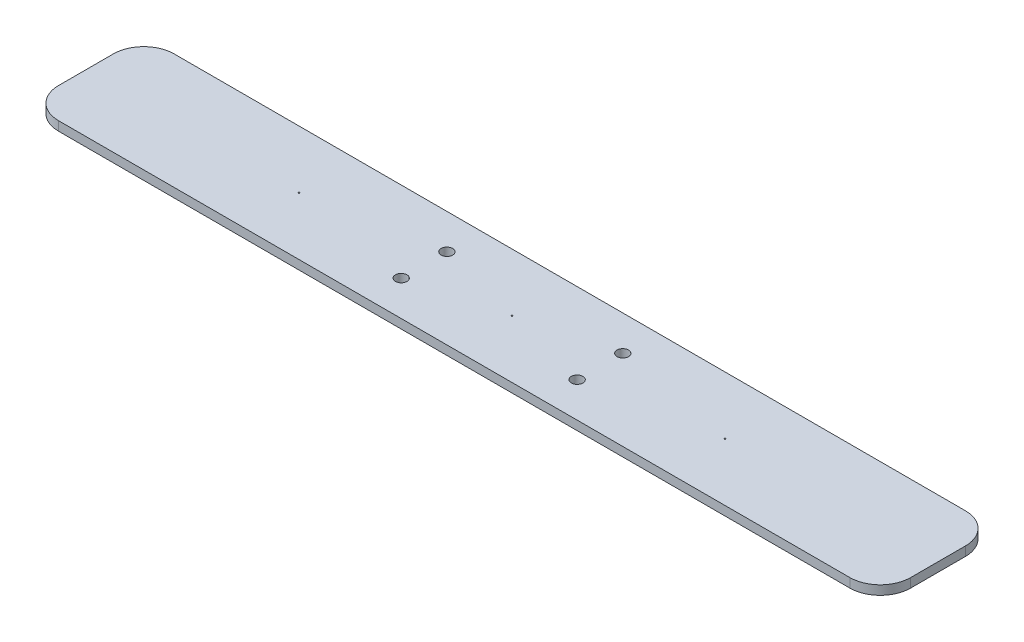
ISO-10303-21;
HEADER;
FILE_DESCRIPTION(('STEP AP214'),'2;1');
FILE_NAME('part.step','',(''),(''),'','','');
FILE_SCHEMA(('AUTOMOTIVE_DESIGN { 1 0 10303 214 1 1 1 1 }'));
ENDSEC;
DATA;
#1=APPLICATION_CONTEXT('core data for automotive mechanical design processes');
#2=APPLICATION_PROTOCOL_DEFINITION('international standard','automotive_design',2000,#1);
#3=PRODUCT_CONTEXT('',#1,'mechanical');
#4=PRODUCT('Part','Part','',(#3));
#5=PRODUCT_RELATED_PRODUCT_CATEGORY('part','',(#4));
#6=PRODUCT_DEFINITION_FORMATION('','',#4);
#7=PRODUCT_DEFINITION_CONTEXT('part definition',#1,'design');
#8=PRODUCT_DEFINITION('design','',#6,#7);
#9=PRODUCT_DEFINITION_SHAPE('','',#8);
#10=(LENGTH_UNIT() NAMED_UNIT(*) SI_UNIT(.MILLI.,.METRE.));
#11=(NAMED_UNIT(*) PLANE_ANGLE_UNIT() SI_UNIT($,.RADIAN.));
#12=(NAMED_UNIT(*) SI_UNIT($,.STERADIAN.) SOLID_ANGLE_UNIT());
#13=UNCERTAINTY_MEASURE_WITH_UNIT(LENGTH_MEASURE(1.E-05),#10,'distance_accuracy_value','');
#14=(GEOMETRIC_REPRESENTATION_CONTEXT(3) GLOBAL_UNCERTAINTY_ASSIGNED_CONTEXT((#13)) GLOBAL_UNIT_ASSIGNED_CONTEXT((#10,
#11,#12)) REPRESENTATION_CONTEXT('',''));
#15=CARTESIAN_POINT('',(0.,0.,0.));
#16=DIRECTION('',(0.,0.,1.));
#17=DIRECTION('',(1.,0.,0.));
#18=AXIS2_PLACEMENT_3D('',#15,#16,#17);
#19=CARTESIAN_POINT('',(10.,3.,28.));
#20=DIRECTION('',(0.,-1.,0.));
#21=DIRECTION('',(0.,0.,-1.));
#22=AXIS2_PLACEMENT_3D('',#19,#20,#21);
#23=CYLINDRICAL_SURFACE('',#22,10.);
#24=CARTESIAN_POINT('',(10.,0.,28.));
#25=DIRECTION('',(0.,1.,0.));
#26=DIRECTION('',(0.,0.,1.));
#27=AXIS2_PLACEMENT_3D('',#24,#25,#26);
#28=CIRCLE('',#27,10.);
#29=CARTESIAN_POINT('',(0.,0.,28.));
#30=VERTEX_POINT('',#29);
#31=CARTESIAN_POINT('',(10.,0.,38.));
#32=VERTEX_POINT('',#31);
#33=EDGE_CURVE('E131',#30,#32,#28,.T.);
#34=ORIENTED_EDGE('',*,*,#33,.T.);
#35=DIRECTION('',(0.,-1.,0.));
#36=VECTOR('',#35,1.);
#37=CARTESIAN_POINT('',(10.,3.,38.));
#38=LINE('',#37,#36);
#39=CARTESIAN_POINT('',(10.,3.,38.));
#40=VERTEX_POINT('',#39);
#41=EDGE_CURVE('E11',#40,#32,#38,.T.);
#42=ORIENTED_EDGE('',*,*,#41,.F.);
#43=CARTESIAN_POINT('',(10.,3.,28.));
#44=DIRECTION('',(0.,1.,0.));
#45=DIRECTION('',(0.,0.,1.));
#46=AXIS2_PLACEMENT_3D('',#43,#44,#45);
#47=CIRCLE('',#46,10.);
#48=CARTESIAN_POINT('',(0.,3.,28.));
#49=VERTEX_POINT('',#48);
#50=EDGE_CURVE('E146',#49,#40,#47,.T.);
#51=ORIENTED_EDGE('',*,*,#50,.F.);
#52=DIRECTION('',(0.,-1.,0.));
#53=VECTOR('',#52,1.);
#54=CARTESIAN_POINT('',(0.,3.,28.));
#55=LINE('',#54,#53);
#56=EDGE_CURVE('E127',#49,#30,#55,.T.);
#57=ORIENTED_EDGE('',*,*,#56,.T.);
#58=EDGE_LOOP('',(#34,#42,#51,#57));
#59=FACE_BOUND('',#58,.T.);
#60=ADVANCED_FACE('F33',(#59),#23,.T.);
#61=CARTESIAN_POINT('',(10.,3.,38.));
#62=DIRECTION('',(0.,0.,-1.));
#63=DIRECTION('',(-1.,0.,0.));
#64=AXIS2_PLACEMENT_3D('',#61,#62,#63);
#65=PLANE('',#64);
#66=DIRECTION('',(1.,0.,0.));
#67=VECTOR('',#66,1.);
#68=CARTESIAN_POINT('',(10.,0.,38.));
#69=LINE('',#68,#67);
#70=CARTESIAN_POINT('',(270.,0.,38.));
#71=VERTEX_POINT('',#70);
#72=EDGE_CURVE('E134',#32,#71,#69,.T.);
#73=ORIENTED_EDGE('',*,*,#72,.T.);
#74=DIRECTION('',(0.,-1.,0.));
#75=VECTOR('',#74,1.);
#76=CARTESIAN_POINT('',(270.,3.,38.));
#77=LINE('',#76,#75);
#78=CARTESIAN_POINT('',(270.,3.,38.));
#79=VERTEX_POINT('',#78);
#80=EDGE_CURVE('E42',#79,#71,#77,.T.);
#81=ORIENTED_EDGE('',*,*,#80,.F.);
#82=DIRECTION('',(1.,0.,0.));
#83=VECTOR('',#82,1.);
#84=CARTESIAN_POINT('',(10.,3.,38.));
#85=LINE('',#84,#83);
#86=EDGE_CURVE('E94',#40,#79,#85,.T.);
#87=ORIENTED_EDGE('',*,*,#86,.F.);
#88=ORIENTED_EDGE('',*,*,#41,.T.);
#89=EDGE_LOOP('',(#73,#81,#87,#88));
#90=FACE_BOUND('',#89,.T.);
#91=ADVANCED_FACE('F231',(#90),#65,.F.);
#92=CARTESIAN_POINT('',(270.,3.,28.));
#93=DIRECTION('',(0.,-1.,0.));
#94=DIRECTION('',(0.,0.,-1.));
#95=AXIS2_PLACEMENT_3D('',#92,#93,#94);
#96=CYLINDRICAL_SURFACE('',#95,10.);
#97=CARTESIAN_POINT('',(270.,0.,28.));
#98=DIRECTION('',(0.,1.,0.));
#99=DIRECTION('',(0.,0.,1.));
#100=AXIS2_PLACEMENT_3D('',#97,#98,#99);
#101=CIRCLE('',#100,10.);
#102=CARTESIAN_POINT('',(280.,0.,28.));
#103=VERTEX_POINT('',#102);
#104=EDGE_CURVE('E137',#71,#103,#101,.T.);
#105=ORIENTED_EDGE('',*,*,#104,.T.);
#106=DIRECTION('',(0.,-1.,0.));
#107=VECTOR('',#106,1.);
#108=CARTESIAN_POINT('',(280.,3.,28.));
#109=LINE('',#108,#107);
#110=CARTESIAN_POINT('',(280.,3.,28.));
#111=VERTEX_POINT('',#110);
#112=EDGE_CURVE('E153',#111,#103,#109,.T.);
#113=ORIENTED_EDGE('',*,*,#112,.F.);
#114=CARTESIAN_POINT('',(270.,3.,28.));
#115=DIRECTION('',(0.,1.,0.));
#116=DIRECTION('',(0.,0.,1.));
#117=AXIS2_PLACEMENT_3D('',#114,#115,#116);
#118=CIRCLE('',#117,10.);
#119=EDGE_CURVE('E199',#79,#111,#118,.T.);
#120=ORIENTED_EDGE('',*,*,#119,.F.);
#121=ORIENTED_EDGE('',*,*,#80,.T.);
#122=EDGE_LOOP('',(#105,#113,#120,#121));
#123=FACE_BOUND('',#122,.T.);
#124=ADVANCED_FACE('F235',(#123),#96,.T.);
#125=CARTESIAN_POINT('',(280.,3.,10.));
#126=DIRECTION('',(-1.,0.,0.));
#127=DIRECTION('',(0.,0.,1.));
#128=AXIS2_PLACEMENT_3D('',#125,#126,#127);
#129=PLANE('',#128);
#130=DIRECTION('',(0.,0.,-1.));
#131=VECTOR('',#130,1.);
#132=CARTESIAN_POINT('',(280.,0.,10.));
#133=LINE('',#132,#131);
#134=CARTESIAN_POINT('',(280.,0.,10.));
#135=VERTEX_POINT('',#134);
#136=EDGE_CURVE('E139',#103,#135,#133,.T.);
#137=ORIENTED_EDGE('',*,*,#136,.T.);
#138=DIRECTION('',(0.,-1.,0.));
#139=VECTOR('',#138,1.);
#140=CARTESIAN_POINT('',(280.,3.,10.));
#141=LINE('',#140,#139);
#142=CARTESIAN_POINT('',(280.,3.,10.));
#143=VERTEX_POINT('',#142);
#144=EDGE_CURVE('E150',#143,#135,#141,.T.);
#145=ORIENTED_EDGE('',*,*,#144,.F.);
#146=DIRECTION('',(0.,0.,-1.));
#147=VECTOR('',#146,1.);
#148=CARTESIAN_POINT('',(280.,3.,10.));
#149=LINE('',#148,#147);
#150=EDGE_CURVE('E201',#111,#143,#149,.T.);
#151=ORIENTED_EDGE('',*,*,#150,.F.);
#152=ORIENTED_EDGE('',*,*,#112,.T.);
#153=EDGE_LOOP('',(#137,#145,#151,#152));
#154=FACE_BOUND('',#153,.T.);
#155=ADVANCED_FACE('F207',(#154),#129,.F.);
#156=CARTESIAN_POINT('',(270.,3.,10.));
#157=DIRECTION('',(0.,-1.,0.));
#158=DIRECTION('',(0.,0.,-1.));
#159=AXIS2_PLACEMENT_3D('',#156,#157,#158);
#160=CYLINDRICAL_SURFACE('',#159,10.);
#161=CARTESIAN_POINT('',(270.,0.,10.));
#162=DIRECTION('',(0.,1.,0.));
#163=DIRECTION('',(0.,0.,-1.));
#164=AXIS2_PLACEMENT_3D('',#161,#162,#163);
#165=CIRCLE('',#164,10.);
#166=CARTESIAN_POINT('',(270.,0.,0.));
#167=VERTEX_POINT('',#166);
#168=EDGE_CURVE('E141',#135,#167,#165,.T.);
#169=ORIENTED_EDGE('',*,*,#168,.T.);
#170=DIRECTION('',(0.,-1.,0.));
#171=VECTOR('',#170,1.);
#172=CARTESIAN_POINT('',(270.,3.,0.));
#173=LINE('',#172,#171);
#174=CARTESIAN_POINT('',(270.,3.,0.));
#175=VERTEX_POINT('',#174);
#176=EDGE_CURVE('E122',#175,#167,#173,.T.);
#177=ORIENTED_EDGE('',*,*,#176,.F.);
#178=CARTESIAN_POINT('',(270.,3.,10.));
#179=DIRECTION('',(0.,1.,0.));
#180=DIRECTION('',(0.,0.,-1.));
#181=AXIS2_PLACEMENT_3D('',#178,#179,#180);
#182=CIRCLE('',#181,10.);
#183=EDGE_CURVE('E113',#143,#175,#182,.T.);
#184=ORIENTED_EDGE('',*,*,#183,.F.);
#185=ORIENTED_EDGE('',*,*,#144,.T.);
#186=EDGE_LOOP('',(#169,#177,#184,#185));
#187=FACE_BOUND('',#186,.T.);
#188=ADVANCED_FACE('F211',(#187),#160,.T.);
#189=CARTESIAN_POINT('',(10.0000000000001,3.,0.));
#190=DIRECTION('',(0.,0.,1.));
#191=DIRECTION('',(1.,0.,0.));
#192=AXIS2_PLACEMENT_3D('',#189,#190,#191);
#193=PLANE('',#192);
#194=DIRECTION('',(-1.,0.,0.));
#195=VECTOR('',#194,1.);
#196=CARTESIAN_POINT('',(10.0000000000001,0.,0.));
#197=LINE('',#196,#195);
#198=CARTESIAN_POINT('',(10.0000000000001,0.,0.));
#199=VERTEX_POINT('',#198);
#200=EDGE_CURVE('E121',#167,#199,#197,.T.);
#201=ORIENTED_EDGE('',*,*,#200,.T.);
#202=DIRECTION('',(0.,-1.,0.));
#203=VECTOR('',#202,1.);
#204=CARTESIAN_POINT('',(10.0000000000001,3.,0.));
#205=LINE('',#204,#203);
#206=CARTESIAN_POINT('',(10.0000000000001,3.,0.));
#207=VERTEX_POINT('',#206);
#208=EDGE_CURVE('E118',#207,#199,#205,.T.);
#209=ORIENTED_EDGE('',*,*,#208,.F.);
#210=DIRECTION('',(-1.,0.,0.));
#211=VECTOR('',#210,1.);
#212=CARTESIAN_POINT('',(10.0000000000001,3.,0.));
#213=LINE('',#212,#211);
#214=EDGE_CURVE('E107',#175,#207,#213,.T.);
#215=ORIENTED_EDGE('',*,*,#214,.F.);
#216=ORIENTED_EDGE('',*,*,#176,.T.);
#217=EDGE_LOOP('',(#201,#209,#215,#216));
#218=FACE_BOUND('',#217,.T.);
#219=ADVANCED_FACE('F119',(#218),#193,.F.);
#220=CARTESIAN_POINT('',(10.,3.,10.));
#221=DIRECTION('',(0.,-1.,0.));
#222=DIRECTION('',(0.,0.,-1.));
#223=AXIS2_PLACEMENT_3D('',#220,#221,#222);
#224=CYLINDRICAL_SURFACE('',#223,10.);
#225=CARTESIAN_POINT('',(10.,0.,10.));
#226=DIRECTION('',(0.,1.,0.));
#227=DIRECTION('',(0.,0.,1.));
#228=AXIS2_PLACEMENT_3D('',#225,#226,#227);
#229=CIRCLE('',#228,10.);
#230=CARTESIAN_POINT('',(0.,0.,10.0000000000001));
#231=VERTEX_POINT('',#230);
#232=EDGE_CURVE('E80',#199,#231,#229,.T.);
#233=ORIENTED_EDGE('',*,*,#232,.T.);
#234=DIRECTION('',(0.,-1.,0.));
#235=VECTOR('',#234,1.);
#236=CARTESIAN_POINT('',(0.,3.,10.0000000000001));
#237=LINE('',#236,#235);
#238=CARTESIAN_POINT('',(0.,3.,10.0000000000001));
#239=VERTEX_POINT('',#238);
#240=EDGE_CURVE('E123',#239,#231,#237,.T.);
#241=ORIENTED_EDGE('',*,*,#240,.F.);
#242=CARTESIAN_POINT('',(10.,3.,10.));
#243=DIRECTION('',(0.,1.,0.));
#244=DIRECTION('',(0.,0.,1.));
#245=AXIS2_PLACEMENT_3D('',#242,#243,#244);
#246=CIRCLE('',#245,10.);
#247=EDGE_CURVE('E111',#207,#239,#246,.T.);
#248=ORIENTED_EDGE('',*,*,#247,.F.);
#249=ORIENTED_EDGE('',*,*,#208,.T.);
#250=EDGE_LOOP('',(#233,#241,#248,#249));
#251=FACE_BOUND('',#250,.T.);
#252=ADVANCED_FACE('F125',(#251),#224,.T.);
#253=CARTESIAN_POINT('',(0.,3.,10.0000000000001));
#254=DIRECTION('',(1.,0.,0.));
#255=DIRECTION('',(0.,0.,-1.));
#256=AXIS2_PLACEMENT_3D('',#253,#254,#255);
#257=PLANE('',#256);
#258=DIRECTION('',(0.,0.,1.));
#259=VECTOR('',#258,1.);
#260=CARTESIAN_POINT('',(0.,0.,10.0000000000001));
#261=LINE('',#260,#259);
#262=EDGE_CURVE('E86',#231,#30,#261,.T.);
#263=ORIENTED_EDGE('',*,*,#262,.T.);
#264=ORIENTED_EDGE('',*,*,#56,.F.);
#265=DIRECTION('',(0.,0.,1.));
#266=VECTOR('',#265,1.);
#267=CARTESIAN_POINT('',(0.,3.,10.0000000000001));
#268=LINE('',#267,#266);
#269=EDGE_CURVE('E51',#239,#49,#268,.T.);
#270=ORIENTED_EDGE('',*,*,#269,.F.);
#271=ORIENTED_EDGE('',*,*,#240,.T.);
#272=EDGE_LOOP('',(#263,#264,#270,#271));
#273=FACE_BOUND('',#272,.T.);
#274=ADVANCED_FACE('F219',(#273),#257,.F.);
#275=CARTESIAN_POINT('',(10.,3.,28.));
#276=DIRECTION('',(0.,1.,0.));
#277=DIRECTION('',(0.,0.,1.));
#278=AXIS2_PLACEMENT_3D('',#275,#276,#277);
#279=PLANE('',#278);
#280=CARTESIAN_POINT('',(70.,3.,19.));
#281=DIRECTION('',(0.,1.,0.));
#282=DIRECTION('',(0.,0.,1.));
#283=AXIS2_PLACEMENT_3D('',#280,#281,#282);
#284=CIRCLE('',#283,0.25);
#285=CARTESIAN_POINT('',(70.,3.,19.25));
#286=VERTEX_POINT('',#285);
#287=EDGE_CURVE('E161',#286,#286,#284,.T.);
#288=ORIENTED_EDGE('',*,*,#287,.F.);
#289=EDGE_LOOP('',(#288));
#290=FACE_BOUND('',#289,.T.);
#291=CARTESIAN_POINT('',(140.,3.,19.));
#292=DIRECTION('',(0.,1.,0.));
#293=DIRECTION('',(0.,0.,1.));
#294=AXIS2_PLACEMENT_3D('',#291,#292,#293);
#295=CIRCLE('',#294,0.250000000000013);
#296=CARTESIAN_POINT('',(140.,3.,19.25));
#297=VERTEX_POINT('',#296);
#298=EDGE_CURVE('E349',#297,#297,#295,.T.);
#299=ORIENTED_EDGE('',*,*,#298,.F.);
#300=EDGE_LOOP('',(#299));
#301=FACE_BOUND('',#300,.T.);
#302=CARTESIAN_POINT('',(210.,3.,19.));
#303=DIRECTION('',(0.,1.,0.));
#304=DIRECTION('',(0.,0.,1.));
#305=AXIS2_PLACEMENT_3D('',#302,#303,#304);
#306=CIRCLE('',#305,0.250000000000013);
#307=CARTESIAN_POINT('',(210.,3.,19.25));
#308=VERTEX_POINT('',#307);
#309=EDGE_CURVE('E178',#308,#308,#306,.T.);
#310=ORIENTED_EDGE('',*,*,#309,.F.);
#311=EDGE_LOOP('',(#310));
#312=FACE_BOUND('',#311,.T.);
#313=CARTESIAN_POINT('',(111.1,3.,11.5));
#314=DIRECTION('',(0.,1.,0.));
#315=DIRECTION('',(0.,0.,1.));
#316=AXIS2_PLACEMENT_3D('',#313,#314,#315);
#317=CIRCLE('',#316,1.89864999999999);
#318=CARTESIAN_POINT('',(111.1,3.,13.39865));
#319=VERTEX_POINT('',#318);
#320=EDGE_CURVE('E166',#319,#319,#317,.T.);
#321=ORIENTED_EDGE('',*,*,#320,.F.);
#322=EDGE_LOOP('',(#321));
#323=FACE_BOUND('',#322,.T.);
#324=CARTESIAN_POINT('',(111.1,3.,26.5));
#325=DIRECTION('',(0.,1.,0.));
#326=DIRECTION('',(0.,0.,1.));
#327=AXIS2_PLACEMENT_3D('',#324,#325,#326);
#328=CIRCLE('',#327,1.89864999999999);
#329=CARTESIAN_POINT('',(111.1,3.,28.39865));
#330=VERTEX_POINT('',#329);
#331=EDGE_CURVE('E175',#330,#330,#328,.T.);
#332=ORIENTED_EDGE('',*,*,#331,.F.);
#333=EDGE_LOOP('',(#332));
#334=FACE_BOUND('',#333,.T.);
#335=CARTESIAN_POINT('',(168.9,3.,26.5));
#336=DIRECTION('',(0.,1.,0.));
#337=DIRECTION('',(0.,0.,1.));
#338=AXIS2_PLACEMENT_3D('',#335,#336,#337);
#339=CIRCLE('',#338,1.89864999999997);
#340=CARTESIAN_POINT('',(168.9,3.,28.39865));
#341=VERTEX_POINT('',#340);
#342=EDGE_CURVE('E186',#341,#341,#339,.T.);
#343=ORIENTED_EDGE('',*,*,#342,.F.);
#344=EDGE_LOOP('',(#343));
#345=FACE_BOUND('',#344,.T.);
#346=CARTESIAN_POINT('',(168.9,3.,11.5));
#347=DIRECTION('',(0.,1.,0.));
#348=DIRECTION('',(0.,0.,1.));
#349=AXIS2_PLACEMENT_3D('',#346,#347,#348);
#350=CIRCLE('',#349,1.89864999999997);
#351=CARTESIAN_POINT('',(168.9,3.,13.39865));
#352=VERTEX_POINT('',#351);
#353=EDGE_CURVE('E192',#352,#352,#350,.T.);
#354=ORIENTED_EDGE('',*,*,#353,.F.);
#355=EDGE_LOOP('',(#354));
#356=FACE_BOUND('',#355,.T.);
#357=ORIENTED_EDGE('',*,*,#50,.T.);
#358=ORIENTED_EDGE('',*,*,#86,.T.);
#359=ORIENTED_EDGE('',*,*,#119,.T.);
#360=ORIENTED_EDGE('',*,*,#150,.T.);
#361=ORIENTED_EDGE('',*,*,#183,.T.);
#362=ORIENTED_EDGE('',*,*,#214,.T.);
#363=ORIENTED_EDGE('',*,*,#247,.T.);
#364=ORIENTED_EDGE('',*,*,#269,.T.);
#365=EDGE_LOOP('',(#357,#358,#359,#360,#361,#362,#363,#364));
#366=FACE_BOUND('',#365,.T.);
#367=ADVANCED_FACE('F109',(#290,#301,#312,#323,#334,#345,#356,#366),#279,.T.);
#368=CARTESIAN_POINT('',(10.,0.,28.));
#369=DIRECTION('',(0.,1.,0.));
#370=DIRECTION('',(0.,0.,1.));
#371=AXIS2_PLACEMENT_3D('',#368,#369,#370);
#372=PLANE('',#371);
#373=CARTESIAN_POINT('',(70.,0.,19.));
#374=DIRECTION('',(0.,1.,0.));
#375=DIRECTION('',(0.,0.,1.));
#376=AXIS2_PLACEMENT_3D('',#373,#374,#375);
#377=CIRCLE('',#376,0.25);
#378=CARTESIAN_POINT('',(70.,0.,19.25));
#379=VERTEX_POINT('',#378);
#380=EDGE_CURVE('E36',#379,#379,#377,.T.);
#381=ORIENTED_EDGE('',*,*,#380,.T.);
#382=EDGE_LOOP('',(#381));
#383=FACE_BOUND('',#382,.T.);
#384=CARTESIAN_POINT('',(140.,0.,19.));
#385=DIRECTION('',(0.,1.,0.));
#386=DIRECTION('',(0.,0.,1.));
#387=AXIS2_PLACEMENT_3D('',#384,#385,#386);
#388=CIRCLE('',#387,0.250000000000013);
#389=CARTESIAN_POINT('',(140.,0.,19.25));
#390=VERTEX_POINT('',#389);
#391=EDGE_CURVE('E160',#390,#390,#388,.T.);
#392=ORIENTED_EDGE('',*,*,#391,.T.);
#393=EDGE_LOOP('',(#392));
#394=FACE_BOUND('',#393,.T.);
#395=CARTESIAN_POINT('',(210.,0.,19.));
#396=DIRECTION('',(0.,1.,0.));
#397=DIRECTION('',(0.,0.,1.));
#398=AXIS2_PLACEMENT_3D('',#395,#396,#397);
#399=CIRCLE('',#398,0.250000000000013);
#400=CARTESIAN_POINT('',(210.,0.,19.25));
#401=VERTEX_POINT('',#400);
#402=EDGE_CURVE('E158',#401,#401,#399,.T.);
#403=ORIENTED_EDGE('',*,*,#402,.T.);
#404=EDGE_LOOP('',(#403));
#405=FACE_BOUND('',#404,.T.);
#406=CARTESIAN_POINT('',(111.1,0.,11.5));
#407=DIRECTION('',(0.,1.,0.));
#408=DIRECTION('',(0.,0.,1.));
#409=AXIS2_PLACEMENT_3D('',#406,#407,#408);
#410=CIRCLE('',#409,1.89865);
#411=CARTESIAN_POINT('',(111.1,0.,13.39865));
#412=VERTEX_POINT('',#411);
#413=EDGE_CURVE('E170',#412,#412,#410,.T.);
#414=ORIENTED_EDGE('',*,*,#413,.T.);
#415=EDGE_LOOP('',(#414));
#416=FACE_BOUND('',#415,.T.);
#417=CARTESIAN_POINT('',(111.1,0.,26.5));
#418=DIRECTION('',(0.,1.,0.));
#419=DIRECTION('',(0.,0.,1.));
#420=AXIS2_PLACEMENT_3D('',#417,#418,#419);
#421=CIRCLE('',#420,1.89865);
#422=CARTESIAN_POINT('',(111.1,0.,28.39865));
#423=VERTEX_POINT('',#422);
#424=EDGE_CURVE('E183',#423,#423,#421,.T.);
#425=ORIENTED_EDGE('',*,*,#424,.T.);
#426=EDGE_LOOP('',(#425));
#427=FACE_BOUND('',#426,.T.);
#428=CARTESIAN_POINT('',(168.9,0.,26.5));
#429=DIRECTION('',(0.,1.,0.));
#430=DIRECTION('',(0.,0.,1.));
#431=AXIS2_PLACEMENT_3D('',#428,#429,#430);
#432=CIRCLE('',#431,1.89865);
#433=CARTESIAN_POINT('',(168.9,0.,28.39865));
#434=VERTEX_POINT('',#433);
#435=EDGE_CURVE('E189',#434,#434,#432,.T.);
#436=ORIENTED_EDGE('',*,*,#435,.T.);
#437=EDGE_LOOP('',(#436));
#438=FACE_BOUND('',#437,.T.);
#439=CARTESIAN_POINT('',(168.9,0.,11.5));
#440=DIRECTION('',(0.,1.,0.));
#441=DIRECTION('',(0.,0.,1.));
#442=AXIS2_PLACEMENT_3D('',#439,#440,#441);
#443=CIRCLE('',#442,1.89865);
#444=CARTESIAN_POINT('',(168.9,0.,13.39865));
#445=VERTEX_POINT('',#444);
#446=EDGE_CURVE('E135',#445,#445,#443,.T.);
#447=ORIENTED_EDGE('',*,*,#446,.T.);
#448=EDGE_LOOP('',(#447));
#449=FACE_BOUND('',#448,.T.);
#450=ORIENTED_EDGE('',*,*,#33,.F.);
#451=ORIENTED_EDGE('',*,*,#262,.F.);
#452=ORIENTED_EDGE('',*,*,#232,.F.);
#453=ORIENTED_EDGE('',*,*,#200,.F.);
#454=ORIENTED_EDGE('',*,*,#168,.F.);
#455=ORIENTED_EDGE('',*,*,#136,.F.);
#456=ORIENTED_EDGE('',*,*,#104,.F.);
#457=ORIENTED_EDGE('',*,*,#72,.F.);
#458=EDGE_LOOP('',(#450,#451,#452,#453,#454,#455,#456,#457));
#459=FACE_BOUND('',#458,.T.);
#460=ADVANCED_FACE('F214',(#383,#394,#405,#416,#427,#438,#449,#459),#372,.F.);
#461=CARTESIAN_POINT('',(168.9,3.,11.5));
#462=DIRECTION('',(0.,1.,0.));
#463=DIRECTION('',(0.,0.,1.));
#464=AXIS2_PLACEMENT_3D('',#461,#462,#463);
#465=CYLINDRICAL_SURFACE('',#464,1.89864999999999);
#466=ORIENTED_EDGE('',*,*,#446,.F.);
#467=EDGE_LOOP('',(#466));
#468=FACE_BOUND('',#467,.T.);
#469=ORIENTED_EDGE('',*,*,#353,.T.);
#470=EDGE_LOOP('',(#469));
#471=FACE_BOUND('',#470,.T.);
#472=ADVANCED_FACE('F265',(#468,#471),#465,.F.);
#473=CARTESIAN_POINT('',(168.9,3.,26.5));
#474=DIRECTION('',(0.,1.,0.));
#475=DIRECTION('',(0.,0.,1.));
#476=AXIS2_PLACEMENT_3D('',#473,#474,#475);
#477=CYLINDRICAL_SURFACE('',#476,1.89864999999999);
#478=ORIENTED_EDGE('',*,*,#435,.F.);
#479=EDGE_LOOP('',(#478));
#480=FACE_BOUND('',#479,.T.);
#481=ORIENTED_EDGE('',*,*,#342,.T.);
#482=EDGE_LOOP('',(#481));
#483=FACE_BOUND('',#482,.T.);
#484=ADVANCED_FACE('F270',(#480,#483),#477,.F.);
#485=CARTESIAN_POINT('',(111.1,3.,26.5));
#486=DIRECTION('',(0.,1.,0.));
#487=DIRECTION('',(0.,0.,1.));
#488=AXIS2_PLACEMENT_3D('',#485,#486,#487);
#489=CYLINDRICAL_SURFACE('',#488,1.89864999999999);
#490=ORIENTED_EDGE('',*,*,#424,.F.);
#491=EDGE_LOOP('',(#490));
#492=FACE_BOUND('',#491,.T.);
#493=ORIENTED_EDGE('',*,*,#331,.T.);
#494=EDGE_LOOP('',(#493));
#495=FACE_BOUND('',#494,.T.);
#496=ADVANCED_FACE('F282',(#492,#495),#489,.F.);
#497=CARTESIAN_POINT('',(111.1,3.,11.5));
#498=DIRECTION('',(0.,1.,0.));
#499=DIRECTION('',(0.,0.,1.));
#500=AXIS2_PLACEMENT_3D('',#497,#498,#499);
#501=CYLINDRICAL_SURFACE('',#500,1.89864999999999);
#502=ORIENTED_EDGE('',*,*,#413,.F.);
#503=EDGE_LOOP('',(#502));
#504=FACE_BOUND('',#503,.T.);
#505=ORIENTED_EDGE('',*,*,#320,.T.);
#506=EDGE_LOOP('',(#505));
#507=FACE_BOUND('',#506,.T.);
#508=ADVANCED_FACE('F292',(#504,#507),#501,.F.);
#509=CARTESIAN_POINT('',(210.,-7.,19.));
#510=DIRECTION('',(0.,1.,0.));
#511=DIRECTION('',(0.,0.,1.));
#512=AXIS2_PLACEMENT_3D('',#509,#510,#511);
#513=CYLINDRICAL_SURFACE('',#512,0.250000000000013);
#514=ORIENTED_EDGE('',*,*,#309,.T.);
#515=EDGE_LOOP('',(#514));
#516=FACE_BOUND('',#515,.T.);
#517=ORIENTED_EDGE('',*,*,#402,.F.);
#518=EDGE_LOOP('',(#517));
#519=FACE_BOUND('',#518,.T.);
#520=ADVANCED_FACE('F302',(#516,#519),#513,.F.);
#521=CARTESIAN_POINT('',(140.,-7.,19.));
#522=DIRECTION('',(0.,1.,0.));
#523=DIRECTION('',(0.,0.,1.));
#524=AXIS2_PLACEMENT_3D('',#521,#522,#523);
#525=CYLINDRICAL_SURFACE('',#524,0.250000000000013);
#526=ORIENTED_EDGE('',*,*,#298,.T.);
#527=EDGE_LOOP('',(#526));
#528=FACE_BOUND('',#527,.T.);
#529=ORIENTED_EDGE('',*,*,#391,.F.);
#530=EDGE_LOOP('',(#529));
#531=FACE_BOUND('',#530,.T.);
#532=ADVANCED_FACE('F322',(#528,#531),#525,.F.);
#533=CARTESIAN_POINT('',(70.,-7.,19.));
#534=DIRECTION('',(0.,1.,0.));
#535=DIRECTION('',(0.,0.,1.));
#536=AXIS2_PLACEMENT_3D('',#533,#534,#535);
#537=CYLINDRICAL_SURFACE('',#536,0.25);
#538=ORIENTED_EDGE('',*,*,#287,.T.);
#539=EDGE_LOOP('',(#538));
#540=FACE_BOUND('',#539,.T.);
#541=ORIENTED_EDGE('',*,*,#380,.F.);
#542=EDGE_LOOP('',(#541));
#543=FACE_BOUND('',#542,.T.);
#544=ADVANCED_FACE('F332',(#540,#543),#537,.F.);
#545=CLOSED_SHELL('',(#60,#91,#124,#155,#188,#219,#252,#274,#367,#460,#472,#484,#496,#508,#520,
#532,#544));
#546=MANIFOLD_SOLID_BREP('B2',#545);
#547=ADVANCED_BREP_SHAPE_REPRESENTATION('',(#18,#546),#14);
#548=SHAPE_DEFINITION_REPRESENTATION(#9,#547);
ENDSEC;
END-ISO-10303-21;
